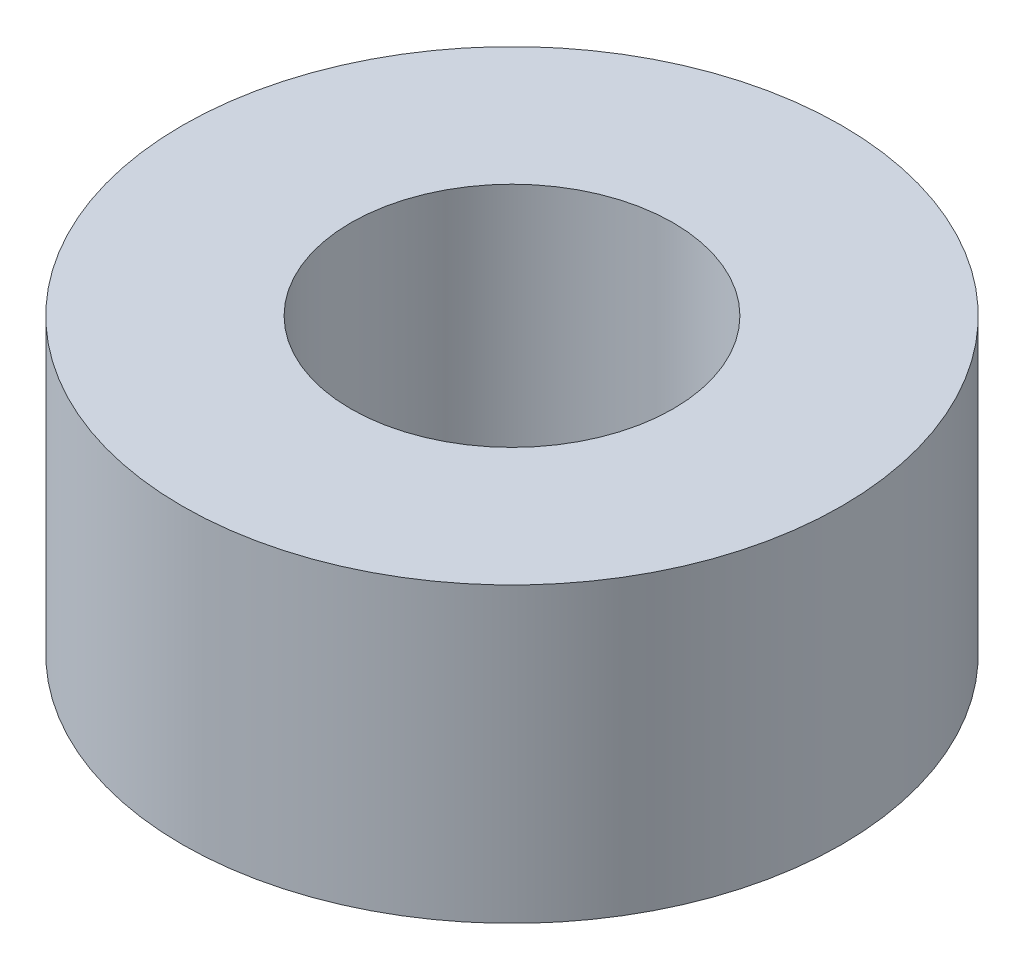
ISO-10303-21;
HEADER;
FILE_DESCRIPTION(('STEP AP214'),'2;1');
FILE_NAME('part.step','',(''),(''),'','','');
FILE_SCHEMA(('AUTOMOTIVE_DESIGN { 1 0 10303 214 1 1 1 1 }'));
ENDSEC;
DATA;
#1=APPLICATION_CONTEXT('core data for automotive mechanical design processes');
#2=APPLICATION_PROTOCOL_DEFINITION('international standard','automotive_design',2000,#1);
#3=PRODUCT_CONTEXT('',#1,'mechanical');
#4=PRODUCT('Part','Part','',(#3));
#5=PRODUCT_RELATED_PRODUCT_CATEGORY('part','',(#4));
#6=PRODUCT_DEFINITION_FORMATION('','',#4);
#7=PRODUCT_DEFINITION_CONTEXT('part definition',#1,'design');
#8=PRODUCT_DEFINITION('design','',#6,#7);
#9=PRODUCT_DEFINITION_SHAPE('','',#8);
#10=(LENGTH_UNIT() NAMED_UNIT(*) SI_UNIT(.MILLI.,.METRE.));
#11=(NAMED_UNIT(*) PLANE_ANGLE_UNIT() SI_UNIT($,.RADIAN.));
#12=(NAMED_UNIT(*) SI_UNIT($,.STERADIAN.) SOLID_ANGLE_UNIT());
#13=UNCERTAINTY_MEASURE_WITH_UNIT(LENGTH_MEASURE(1.E-05),#10,'distance_accuracy_value','');
#14=(GEOMETRIC_REPRESENTATION_CONTEXT(3) GLOBAL_UNCERTAINTY_ASSIGNED_CONTEXT((#13)) GLOBAL_UNIT_ASSIGNED_CONTEXT((#10,
#11,#12)) REPRESENTATION_CONTEXT('',''));
#15=CARTESIAN_POINT('',(0.,0.,0.));
#16=DIRECTION('',(0.,0.,1.));
#17=DIRECTION('',(1.,0.,0.));
#18=AXIS2_PLACEMENT_3D('',#15,#16,#17);
#19=CARTESIAN_POINT('',(0.,2.,0.));
#20=DIRECTION('',(0.,1.,0.));
#21=DIRECTION('',(0.,0.,1.));
#22=AXIS2_PLACEMENT_3D('',#19,#20,#21);
#23=PLANE('',#22);
#24=CARTESIAN_POINT('',(0.,2.,0.));
#25=DIRECTION('',(0.,1.,0.));
#26=DIRECTION('',(0.,0.,1.));
#27=AXIS2_PLACEMENT_3D('',#24,#25,#26);
#28=CIRCLE('',#27,2.25);
#29=CARTESIAN_POINT('',(0.,2.,2.25));
#30=VERTEX_POINT('',#29);
#31=EDGE_CURVE('E10',#30,#30,#28,.T.);
#32=ORIENTED_EDGE('',*,*,#31,.T.);
#33=EDGE_LOOP('',(#32));
#34=FACE_BOUND('',#33,.T.);
#35=CARTESIAN_POINT('',(0.,2.,0.));
#36=DIRECTION('',(0.,1.,0.));
#37=DIRECTION('',(0.,0.,1.));
#38=AXIS2_PLACEMENT_3D('',#35,#36,#37);
#39=CIRCLE('',#38,1.1);
#40=CARTESIAN_POINT('',(0.,2.,1.1));
#41=VERTEX_POINT('',#40);
#42=EDGE_CURVE('E50',#41,#41,#39,.T.);
#43=ORIENTED_EDGE('',*,*,#42,.F.);
#44=EDGE_LOOP('',(#43));
#45=FACE_BOUND('',#44,.T.);
#46=ADVANCED_FACE('F37',(#34,#45),#23,.T.);
#47=CARTESIAN_POINT('',(0.,0.,0.));
#48=DIRECTION('',(0.,1.,0.));
#49=DIRECTION('',(0.,0.,1.));
#50=AXIS2_PLACEMENT_3D('',#47,#48,#49);
#51=PLANE('',#50);
#52=CARTESIAN_POINT('',(0.,0.,0.));
#53=DIRECTION('',(0.,1.,0.));
#54=DIRECTION('',(0.,0.,1.));
#55=AXIS2_PLACEMENT_3D('',#52,#53,#54);
#56=CIRCLE('',#55,2.25);
#57=CARTESIAN_POINT('',(0.,0.,2.25));
#58=VERTEX_POINT('',#57);
#59=EDGE_CURVE('E41',#58,#58,#56,.T.);
#60=ORIENTED_EDGE('',*,*,#59,.F.);
#61=EDGE_LOOP('',(#60));
#62=FACE_BOUND('',#61,.T.);
#63=CARTESIAN_POINT('',(0.,0.,0.));
#64=DIRECTION('',(0.,1.,0.));
#65=DIRECTION('',(0.,0.,1.));
#66=AXIS2_PLACEMENT_3D('',#63,#64,#65);
#67=CIRCLE('',#66,1.1);
#68=CARTESIAN_POINT('',(0.,0.,1.1));
#69=VERTEX_POINT('',#68);
#70=EDGE_CURVE('E52',#69,#69,#67,.T.);
#71=ORIENTED_EDGE('',*,*,#70,.T.);
#72=EDGE_LOOP('',(#71));
#73=FACE_BOUND('',#72,.T.);
#74=ADVANCED_FACE('F64',(#62,#73),#51,.F.);
#75=CARTESIAN_POINT('',(0.,2.,0.));
#76=DIRECTION('',(0.,-1.,0.));
#77=DIRECTION('',(0.,0.,-1.));
#78=AXIS2_PLACEMENT_3D('',#75,#76,#77);
#79=CYLINDRICAL_SURFACE('',#78,2.25);
#80=ORIENTED_EDGE('',*,*,#31,.F.);
#81=EDGE_LOOP('',(#80));
#82=FACE_BOUND('',#81,.T.);
#83=ORIENTED_EDGE('',*,*,#59,.T.);
#84=EDGE_LOOP('',(#83));
#85=FACE_BOUND('',#84,.T.);
#86=ADVANCED_FACE('F39',(#82,#85),#79,.T.);
#87=CARTESIAN_POINT('',(0.,2.,0.));
#88=DIRECTION('',(0.,-1.,0.));
#89=DIRECTION('',(0.,0.,-1.));
#90=AXIS2_PLACEMENT_3D('',#87,#88,#89);
#91=CYLINDRICAL_SURFACE('',#90,1.1);
#92=ORIENTED_EDGE('',*,*,#42,.T.);
#93=EDGE_LOOP('',(#92));
#94=FACE_BOUND('',#93,.T.);
#95=ORIENTED_EDGE('',*,*,#70,.F.);
#96=EDGE_LOOP('',(#95));
#97=FACE_BOUND('',#96,.T.);
#98=ADVANCED_FACE('F60',(#94,#97),#91,.F.);
#99=CLOSED_SHELL('',(#46,#74,#86,#98));
#100=MANIFOLD_SOLID_BREP('B2',#99);
#101=ADVANCED_BREP_SHAPE_REPRESENTATION('',(#18,#100),#14);
#102=SHAPE_DEFINITION_REPRESENTATION(#9,#101);
ENDSEC;
END-ISO-10303-21;
